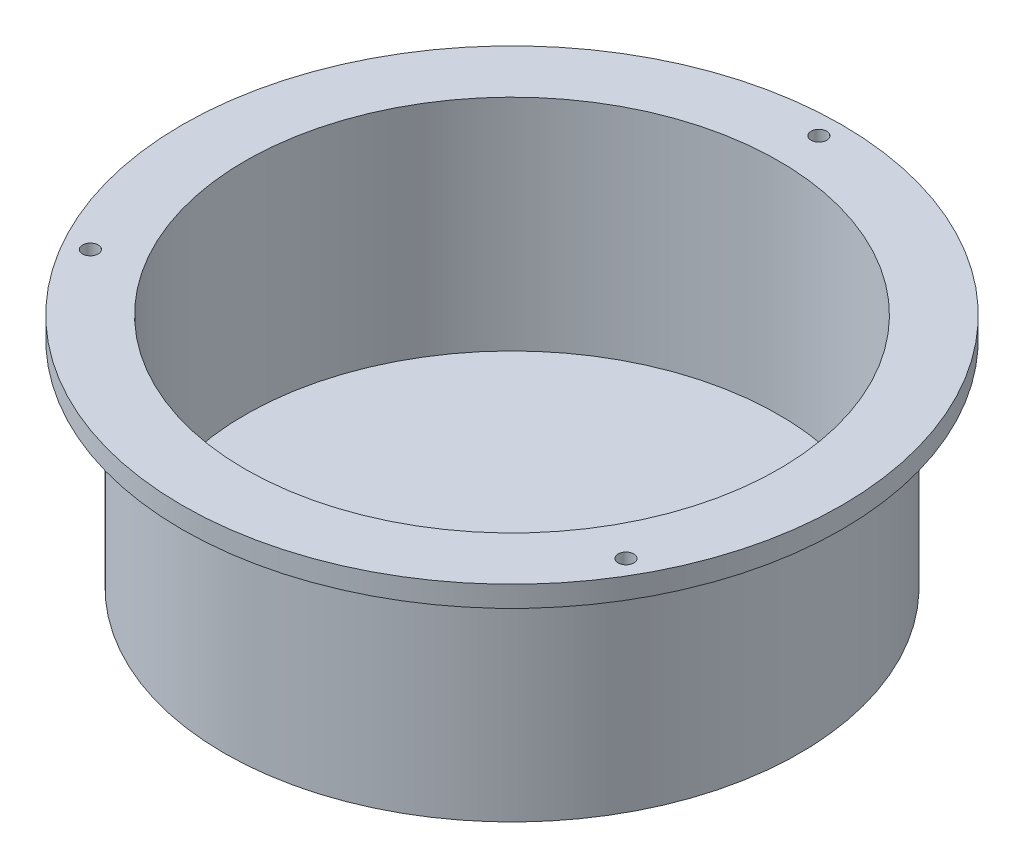
ISO-10303-21;
HEADER;
FILE_DESCRIPTION(('STEP AP214'),'2;1');
FILE_NAME('part.step','',(''),(''),'','','');
FILE_SCHEMA(('AUTOMOTIVE_DESIGN { 1 0 10303 214 1 1 1 1 }'));
ENDSEC;
DATA;
#1=APPLICATION_CONTEXT('core data for automotive mechanical design processes');
#2=APPLICATION_PROTOCOL_DEFINITION('international standard','automotive_design',2000,#1);
#3=PRODUCT_CONTEXT('',#1,'mechanical');
#4=PRODUCT('Part','Part','',(#3));
#5=PRODUCT_RELATED_PRODUCT_CATEGORY('part','',(#4));
#6=PRODUCT_DEFINITION_FORMATION('','',#4);
#7=PRODUCT_DEFINITION_CONTEXT('part definition',#1,'design');
#8=PRODUCT_DEFINITION('design','',#6,#7);
#9=PRODUCT_DEFINITION_SHAPE('','',#8);
#10=(LENGTH_UNIT() NAMED_UNIT(*) SI_UNIT(.MILLI.,.METRE.));
#11=(NAMED_UNIT(*) PLANE_ANGLE_UNIT() SI_UNIT($,.RADIAN.));
#12=(NAMED_UNIT(*) SI_UNIT($,.STERADIAN.) SOLID_ANGLE_UNIT());
#13=UNCERTAINTY_MEASURE_WITH_UNIT(LENGTH_MEASURE(1.E-05),#10,'distance_accuracy_value','');
#14=(GEOMETRIC_REPRESENTATION_CONTEXT(3) GLOBAL_UNCERTAINTY_ASSIGNED_CONTEXT((#13)) GLOBAL_UNIT_ASSIGNED_CONTEXT((#10,
#11,#12)) REPRESENTATION_CONTEXT('',''));
#15=CARTESIAN_POINT('',(0.,0.,0.));
#16=DIRECTION('',(0.,0.,1.));
#17=DIRECTION('',(1.,0.,0.));
#18=AXIS2_PLACEMENT_3D('',#15,#16,#17);
#19=CARTESIAN_POINT('',(0.,41.,0.));
#20=DIRECTION('',(0.,-1.,0.));
#21=DIRECTION('',(0.,0.,-1.));
#22=AXIS2_PLACEMENT_3D('',#19,#20,#21);
#23=CYLINDRICAL_SURFACE('',#22,55.);
#24=CARTESIAN_POINT('',(0.,41.,0.));
#25=DIRECTION('',(0.,1.,0.));
#26=DIRECTION('',(0.,0.,1.));
#27=AXIS2_PLACEMENT_3D('',#24,#25,#26);
#28=CIRCLE('',#27,55.);
#29=CARTESIAN_POINT('',(0.,41.,55.));
#30=VERTEX_POINT('',#29);
#31=EDGE_CURVE('E11',#30,#30,#28,.T.);
#32=ORIENTED_EDGE('',*,*,#31,.F.);
#33=EDGE_LOOP('',(#32));
#34=FACE_BOUND('',#33,.T.);
#35=CARTESIAN_POINT('',(0.,0.,0.));
#36=DIRECTION('',(0.,1.,0.));
#37=DIRECTION('',(0.,0.,1.));
#38=AXIS2_PLACEMENT_3D('',#35,#36,#37);
#39=CIRCLE('',#38,55.);
#40=CARTESIAN_POINT('',(0.,0.,55.));
#41=VERTEX_POINT('',#40);
#42=EDGE_CURVE('E42',#41,#41,#39,.T.);
#43=ORIENTED_EDGE('',*,*,#42,.T.);
#44=EDGE_LOOP('',(#43));
#45=FACE_BOUND('',#44,.T.);
#46=ADVANCED_FACE('F39',(#34,#45),#23,.T.);
#47=CARTESIAN_POINT('',(0.,0.,0.));
#48=DIRECTION('',(0.,1.,0.));
#49=DIRECTION('',(0.,0.,1.));
#50=AXIS2_PLACEMENT_3D('',#47,#48,#49);
#51=PLANE('',#50);
#52=CARTESIAN_POINT('',(0.,0.,0.));
#53=DIRECTION('',(0.,-1.,0.));
#54=DIRECTION('',(0.,0.,-1.));
#55=AXIS2_PLACEMENT_3D('',#52,#53,#54);
#56=CIRCLE('',#55,5.);
#57=CARTESIAN_POINT('',(0.,0.,-5.));
#58=VERTEX_POINT('',#57);
#59=EDGE_CURVE('E72',#58,#58,#56,.T.);
#60=ORIENTED_EDGE('',*,*,#59,.F.);
#61=EDGE_LOOP('',(#60));
#62=FACE_BOUND('',#61,.T.);
#63=ORIENTED_EDGE('',*,*,#42,.F.);
#64=EDGE_LOOP('',(#63));
#65=FACE_BOUND('',#64,.T.);
#66=ADVANCED_FACE('F119',(#62,#65),#51,.F.);
#67=CARTESIAN_POINT('',(0.,45.,0.));
#68=DIRECTION('',(0.,-1.,0.));
#69=DIRECTION('',(0.,0.,-1.));
#70=AXIS2_PLACEMENT_3D('',#67,#68,#69);
#71=CYLINDRICAL_SURFACE('',#70,63.);
#72=CARTESIAN_POINT('',(0.,45.,0.));
#73=DIRECTION('',(0.,1.,0.));
#74=DIRECTION('',(0.,0.,1.));
#75=AXIS2_PLACEMENT_3D('',#72,#73,#74);
#76=CIRCLE('',#75,63.);
#77=CARTESIAN_POINT('',(0.,45.,63.));
#78=VERTEX_POINT('',#77);
#79=EDGE_CURVE('E51',#78,#78,#76,.T.);
#80=ORIENTED_EDGE('',*,*,#79,.F.);
#81=EDGE_LOOP('',(#80));
#82=FACE_BOUND('',#81,.T.);
#83=CARTESIAN_POINT('',(0.,41.,0.));
#84=DIRECTION('',(0.,1.,0.));
#85=DIRECTION('',(0.,0.,1.));
#86=AXIS2_PLACEMENT_3D('',#83,#84,#85);
#87=CIRCLE('',#86,63.);
#88=CARTESIAN_POINT('',(0.,41.,63.));
#89=VERTEX_POINT('',#88);
#90=EDGE_CURVE('E53',#89,#89,#87,.T.);
#91=ORIENTED_EDGE('',*,*,#90,.T.);
#92=EDGE_LOOP('',(#91));
#93=FACE_BOUND('',#92,.T.);
#94=ADVANCED_FACE('F107',(#82,#93),#71,.T.);
#95=CARTESIAN_POINT('',(0.,45.,0.));
#96=DIRECTION('',(0.,1.,0.));
#97=DIRECTION('',(0.,0.,1.));
#98=AXIS2_PLACEMENT_3D('',#95,#96,#97);
#99=PLANE('',#98);
#100=CARTESIAN_POINT('',(-0.350950896839404,45.,-58.9989562065975));
#101=DIRECTION('',(0.,1.,0.));
#102=DIRECTION('',(0.,0.,1.));
#103=AXIS2_PLACEMENT_3D('',#100,#101,#102);
#104=CIRCLE('',#103,1.5);
#105=CARTESIAN_POINT('',(-0.350950896839404,45.,-57.4989562065975));
#106=VERTEX_POINT('',#105);
#107=EDGE_CURVE('E90',#106,#106,#104,.T.);
#108=ORIENTED_EDGE('',*,*,#107,.F.);
#109=EDGE_LOOP('',(#108));
#110=FACE_BOUND('',#109,.T.);
#111=CARTESIAN_POINT('',(-51.1383311669029,45.,29.4256875104757));
#112=DIRECTION('',(0.,1.,0.));
#113=DIRECTION('',(0.,0.,1.));
#114=AXIS2_PLACEMENT_3D('',#111,#112,#113);
#115=CIRCLE('',#114,1.5);
#116=CARTESIAN_POINT('',(-51.1383311669029,45.,30.9256875104757));
#117=VERTEX_POINT('',#116);
#118=EDGE_CURVE('E81',#117,#117,#115,.T.);
#119=ORIENTED_EDGE('',*,*,#118,.F.);
#120=EDGE_LOOP('',(#119));
#121=FACE_BOUND('',#120,.T.);
#122=CARTESIAN_POINT('',(51.1616688330971,45.,29.3850921763486));
#123=DIRECTION('',(0.,1.,0.));
#124=DIRECTION('',(0.,0.,1.));
#125=AXIS2_PLACEMENT_3D('',#122,#123,#124);
#126=CIRCLE('',#125,1.5);
#127=CARTESIAN_POINT('',(51.1616688330971,45.,30.8850921763486));
#128=VERTEX_POINT('',#127);
#129=EDGE_CURVE('E82',#128,#128,#126,.T.);
#130=ORIENTED_EDGE('',*,*,#129,.F.);
#131=EDGE_LOOP('',(#130));
#132=FACE_BOUND('',#131,.T.);
#133=CARTESIAN_POINT('',(0.,45.,0.));
#134=DIRECTION('',(0.,1.,0.));
#135=DIRECTION('',(0.,0.,1.));
#136=AXIS2_PLACEMENT_3D('',#133,#134,#135);
#137=CIRCLE('',#136,51.);
#138=CARTESIAN_POINT('',(0.,45.,51.));
#139=VERTEX_POINT('',#138);
#140=EDGE_CURVE('E64',#139,#139,#137,.T.);
#141=ORIENTED_EDGE('',*,*,#140,.F.);
#142=EDGE_LOOP('',(#141));
#143=FACE_BOUND('',#142,.T.);
#144=ORIENTED_EDGE('',*,*,#79,.T.);
#145=EDGE_LOOP('',(#144));
#146=FACE_BOUND('',#145,.T.);
#147=ADVANCED_FACE('F103',(#110,#121,#132,#143,#146),#99,.T.);
#148=CARTESIAN_POINT('',(0.,41.,0.));
#149=DIRECTION('',(0.,1.,0.));
#150=DIRECTION('',(0.,0.,1.));
#151=AXIS2_PLACEMENT_3D('',#148,#149,#150);
#152=PLANE('',#151);
#153=CARTESIAN_POINT('',(-0.350950896839404,41.,-58.9989562065975));
#154=DIRECTION('',(0.,1.,0.));
#155=DIRECTION('',(0.,0.,1.));
#156=AXIS2_PLACEMENT_3D('',#153,#154,#155);
#157=CIRCLE('',#156,1.5);
#158=CARTESIAN_POINT('',(-0.350950896839404,41.,-57.4989562065975));
#159=VERTEX_POINT('',#158);
#160=EDGE_CURVE('E76',#159,#159,#157,.F.);
#161=ORIENTED_EDGE('',*,*,#160,.F.);
#162=EDGE_LOOP('',(#161));
#163=FACE_BOUND('',#162,.T.);
#164=CARTESIAN_POINT('',(-51.1383311669029,41.,29.4256875104757));
#165=DIRECTION('',(0.,1.,0.));
#166=DIRECTION('',(0.,0.,1.));
#167=AXIS2_PLACEMENT_3D('',#164,#165,#166);
#168=CIRCLE('',#167,1.5);
#169=CARTESIAN_POINT('',(-51.1383311669029,41.,30.9256875104757));
#170=VERTEX_POINT('',#169);
#171=EDGE_CURVE('E86',#170,#170,#168,.F.);
#172=ORIENTED_EDGE('',*,*,#171,.F.);
#173=EDGE_LOOP('',(#172));
#174=FACE_BOUND('',#173,.T.);
#175=CARTESIAN_POINT('',(51.1616688330971,41.,29.3850921763486));
#176=DIRECTION('',(0.,1.,0.));
#177=DIRECTION('',(0.,0.,1.));
#178=AXIS2_PLACEMENT_3D('',#175,#176,#177);
#179=CIRCLE('',#178,1.5);
#180=CARTESIAN_POINT('',(51.1616688330971,41.,30.8850921763486));
#181=VERTEX_POINT('',#180);
#182=EDGE_CURVE('E77',#181,#181,#179,.F.);
#183=ORIENTED_EDGE('',*,*,#182,.F.);
#184=EDGE_LOOP('',(#183));
#185=FACE_BOUND('',#184,.T.);
#186=ORIENTED_EDGE('',*,*,#31,.T.);
#187=EDGE_LOOP('',(#186));
#188=FACE_BOUND('',#187,.T.);
#189=ORIENTED_EDGE('',*,*,#90,.F.);
#190=EDGE_LOOP('',(#189));
#191=FACE_BOUND('',#190,.T.);
#192=ADVANCED_FACE('F106',(#163,#174,#185,#188,#191),#152,.F.);
#193=CARTESIAN_POINT('',(0.,-144.249783362056,0.));
#194=DIRECTION('',(0.,1.,0.));
#195=DIRECTION('',(0.,0.,1.));
#196=AXIS2_PLACEMENT_3D('',#193,#194,#195);
#197=CYLINDRICAL_SURFACE('',#196,51.);
#198=CARTESIAN_POINT('',(0.,3.,0.));
#199=DIRECTION('',(0.,1.,0.));
#200=DIRECTION('',(0.,0.,1.));
#201=AXIS2_PLACEMENT_3D('',#198,#199,#200);
#202=CIRCLE('',#201,51.);
#203=CARTESIAN_POINT('',(0.,3.,51.));
#204=VERTEX_POINT('',#203);
#205=EDGE_CURVE('E57',#204,#204,#202,.F.);
#206=ORIENTED_EDGE('',*,*,#205,.T.);
#207=EDGE_LOOP('',(#206));
#208=FACE_BOUND('',#207,.T.);
#209=ORIENTED_EDGE('',*,*,#140,.T.);
#210=EDGE_LOOP('',(#209));
#211=FACE_BOUND('',#210,.T.);
#212=ADVANCED_FACE('F124',(#208,#211),#197,.F.);
#213=CARTESIAN_POINT('',(0.,3.,0.));
#214=DIRECTION('',(0.,1.,0.));
#215=DIRECTION('',(0.,0.,1.));
#216=AXIS2_PLACEMENT_3D('',#213,#214,#215);
#217=PLANE('',#216);
#218=CARTESIAN_POINT('',(0.,3.,0.));
#219=DIRECTION('',(0.,1.,0.));
#220=DIRECTION('',(0.,0.,1.));
#221=AXIS2_PLACEMENT_3D('',#218,#219,#220);
#222=CIRCLE('',#221,5.);
#223=CARTESIAN_POINT('',(0.,3.,5.));
#224=VERTEX_POINT('',#223);
#225=EDGE_CURVE('E68',#224,#224,#222,.F.);
#226=ORIENTED_EDGE('',*,*,#225,.T.);
#227=EDGE_LOOP('',(#226));
#228=FACE_BOUND('',#227,.T.);
#229=ORIENTED_EDGE('',*,*,#205,.F.);
#230=EDGE_LOOP('',(#229));
#231=FACE_BOUND('',#230,.T.);
#232=ADVANCED_FACE('F130',(#228,#231),#217,.T.);
#233=CARTESIAN_POINT('',(0.,17.142135623731,0.));
#234=DIRECTION('',(0.,-1.,0.));
#235=DIRECTION('',(0.,0.,-1.));
#236=AXIS2_PLACEMENT_3D('',#233,#234,#235);
#237=CYLINDRICAL_SURFACE('',#236,5.);
#238=ORIENTED_EDGE('',*,*,#59,.T.);
#239=EDGE_LOOP('',(#238));
#240=FACE_BOUND('',#239,.T.);
#241=ORIENTED_EDGE('',*,*,#225,.F.);
#242=EDGE_LOOP('',(#241));
#243=FACE_BOUND('',#242,.T.);
#244=ADVANCED_FACE('F148',(#240,#243),#237,.F.);
#245=CARTESIAN_POINT('',(51.1616688330971,36.7573593128807,29.3850921763486));
#246=DIRECTION('',(0.,1.,0.));
#247=DIRECTION('',(0.,0.,1.));
#248=AXIS2_PLACEMENT_3D('',#245,#246,#247);
#249=CYLINDRICAL_SURFACE('',#248,1.5);
#250=ORIENTED_EDGE('',*,*,#182,.T.);
#251=EDGE_LOOP('',(#250));
#252=FACE_BOUND('',#251,.T.);
#253=ORIENTED_EDGE('',*,*,#129,.T.);
#254=EDGE_LOOP('',(#253));
#255=FACE_BOUND('',#254,.T.);
#256=ADVANCED_FACE('F151',(#252,#255),#249,.F.);
#257=CARTESIAN_POINT('',(-51.1383311669029,36.7573593128807,29.4256875104757));
#258=DIRECTION('',(0.,1.,0.));
#259=DIRECTION('',(0.,0.,1.));
#260=AXIS2_PLACEMENT_3D('',#257,#258,#259);
#261=CYLINDRICAL_SURFACE('',#260,1.5);
#262=ORIENTED_EDGE('',*,*,#171,.T.);
#263=EDGE_LOOP('',(#262));
#264=FACE_BOUND('',#263,.T.);
#265=ORIENTED_EDGE('',*,*,#118,.T.);
#266=EDGE_LOOP('',(#265));
#267=FACE_BOUND('',#266,.T.);
#268=ADVANCED_FACE('F165',(#264,#267),#261,.F.);
#269=CARTESIAN_POINT('',(-0.350950896839404,36.7573593128807,-58.9989562065975));
#270=DIRECTION('',(0.,1.,0.));
#271=DIRECTION('',(0.,0.,1.));
#272=AXIS2_PLACEMENT_3D('',#269,#270,#271);
#273=CYLINDRICAL_SURFACE('',#272,1.5);
#274=ORIENTED_EDGE('',*,*,#160,.T.);
#275=EDGE_LOOP('',(#274));
#276=FACE_BOUND('',#275,.T.);
#277=ORIENTED_EDGE('',*,*,#107,.T.);
#278=EDGE_LOOP('',(#277));
#279=FACE_BOUND('',#278,.T.);
#280=ADVANCED_FACE('F101',(#276,#279),#273,.F.);
#281=CLOSED_SHELL('',(#46,#66,#94,#147,#192,#212,#232,#244,#256,#268,#280));
#282=MANIFOLD_SOLID_BREP('B2',#281);
#283=ADVANCED_BREP_SHAPE_REPRESENTATION('',(#18,#282),#14);
#284=SHAPE_DEFINITION_REPRESENTATION(#9,#283);
ENDSEC;
END-ISO-10303-21;
